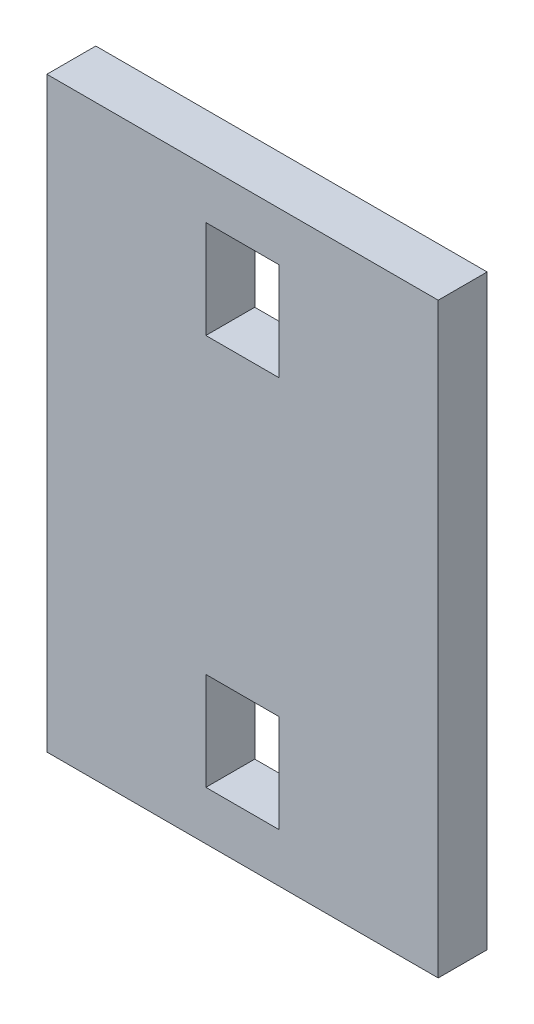
ISO-10303-21;
HEADER;
FILE_DESCRIPTION(('STEP AP214'),'2;1');
FILE_NAME('part.step','',(''),(''),'','','');
FILE_SCHEMA(('AUTOMOTIVE_DESIGN { 1 0 10303 214 1 1 1 1 }'));
ENDSEC;
DATA;
#1=APPLICATION_CONTEXT('core data for automotive mechanical design processes');
#2=APPLICATION_PROTOCOL_DEFINITION('international standard','automotive_design',2000,#1);
#3=PRODUCT_CONTEXT('',#1,'mechanical');
#4=PRODUCT('Part','Part','',(#3));
#5=PRODUCT_RELATED_PRODUCT_CATEGORY('part','',(#4));
#6=PRODUCT_DEFINITION_FORMATION('','',#4);
#7=PRODUCT_DEFINITION_CONTEXT('part definition',#1,'design');
#8=PRODUCT_DEFINITION('design','',#6,#7);
#9=PRODUCT_DEFINITION_SHAPE('','',#8);
#10=(LENGTH_UNIT() NAMED_UNIT(*) SI_UNIT(.MILLI.,.METRE.));
#11=(NAMED_UNIT(*) PLANE_ANGLE_UNIT() SI_UNIT($,.RADIAN.));
#12=(NAMED_UNIT(*) SI_UNIT($,.STERADIAN.) SOLID_ANGLE_UNIT());
#13=UNCERTAINTY_MEASURE_WITH_UNIT(LENGTH_MEASURE(1.E-05),#10,'distance_accuracy_value','');
#14=(GEOMETRIC_REPRESENTATION_CONTEXT(3) GLOBAL_UNCERTAINTY_ASSIGNED_CONTEXT((#13)) GLOBAL_UNIT_ASSIGNED_CONTEXT((#10,
#11,#12)) REPRESENTATION_CONTEXT('',''));
#15=CARTESIAN_POINT('',(0.,0.,0.));
#16=DIRECTION('',(0.,0.,1.));
#17=DIRECTION('',(1.,0.,0.));
#18=AXIS2_PLACEMENT_3D('',#15,#16,#17);
#19=CARTESIAN_POINT('',(0.,0.,6.35));
#20=DIRECTION('',(0.,1.,0.));
#21=DIRECTION('',(0.,0.,1.));
#22=AXIS2_PLACEMENT_3D('',#19,#20,#21);
#23=PLANE('',#22);
#24=DIRECTION('',(1.,0.,0.));
#25=VECTOR('',#24,1.);
#26=CARTESIAN_POINT('',(0.,0.,0.));
#27=LINE('',#26,#25);
#28=CARTESIAN_POINT('',(-50.8,0.,0.));
#29=VERTEX_POINT('',#28);
#30=CARTESIAN_POINT('',(0.,0.,0.));
#31=VERTEX_POINT('',#30);
#32=EDGE_CURVE('E162',#29,#31,#27,.T.);
#33=ORIENTED_EDGE('',*,*,#32,.T.);
#34=DIRECTION('',(0.,0.,-1.));
#35=VECTOR('',#34,1.);
#36=CARTESIAN_POINT('',(0.,0.,6.35));
#37=LINE('',#36,#35);
#38=CARTESIAN_POINT('',(0.,0.,6.35));
#39=VERTEX_POINT('',#38);
#40=EDGE_CURVE('E11',#39,#31,#37,.T.);
#41=ORIENTED_EDGE('',*,*,#40,.F.);
#42=DIRECTION('',(1.,0.,0.));
#43=VECTOR('',#42,1.);
#44=CARTESIAN_POINT('',(0.,0.,6.35));
#45=LINE('',#44,#43);
#46=CARTESIAN_POINT('',(-50.8,0.,6.35));
#47=VERTEX_POINT('',#46);
#48=EDGE_CURVE('E197',#47,#39,#45,.T.);
#49=ORIENTED_EDGE('',*,*,#48,.F.);
#50=DIRECTION('',(0.,0.,-1.));
#51=VECTOR('',#50,1.);
#52=CARTESIAN_POINT('',(-50.8,0.,6.35));
#53=LINE('',#52,#51);
#54=EDGE_CURVE('E210',#47,#29,#53,.T.);
#55=ORIENTED_EDGE('',*,*,#54,.T.);
#56=EDGE_LOOP('',(#33,#41,#49,#55));
#57=FACE_BOUND('',#56,.T.);
#58=ADVANCED_FACE('F39',(#57),#23,.F.);
#59=CARTESIAN_POINT('',(0.,0.,6.35));
#60=DIRECTION('',(-1.,0.,0.));
#61=DIRECTION('',(0.,0.,1.));
#62=AXIS2_PLACEMENT_3D('',#59,#60,#61);
#63=PLANE('',#62);
#64=DIRECTION('',(0.,1.,0.));
#65=VECTOR('',#64,1.);
#66=CARTESIAN_POINT('',(0.,0.,0.));
#67=LINE('',#66,#65);
#68=CARTESIAN_POINT('',(0.,76.2,0.));
#69=VERTEX_POINT('',#68);
#70=EDGE_CURVE('E209',#31,#69,#67,.T.);
#71=ORIENTED_EDGE('',*,*,#70,.T.);
#72=DIRECTION('',(0.,0.,-1.));
#73=VECTOR('',#72,1.);
#74=CARTESIAN_POINT('',(0.,76.2,6.35));
#75=LINE('',#74,#73);
#76=CARTESIAN_POINT('',(0.,76.2,6.35));
#77=VERTEX_POINT('',#76);
#78=EDGE_CURVE('E46',#77,#69,#75,.T.);
#79=ORIENTED_EDGE('',*,*,#78,.F.);
#80=DIRECTION('',(0.,1.,0.));
#81=VECTOR('',#80,1.);
#82=CARTESIAN_POINT('',(0.,0.,6.35));
#83=LINE('',#82,#81);
#84=EDGE_CURVE('E199',#39,#77,#83,.T.);
#85=ORIENTED_EDGE('',*,*,#84,.F.);
#86=ORIENTED_EDGE('',*,*,#40,.T.);
#87=EDGE_LOOP('',(#71,#79,#85,#86));
#88=FACE_BOUND('',#87,.T.);
#89=ADVANCED_FACE('F239',(#88),#63,.F.);
#90=CARTESIAN_POINT('',(0.,76.2,6.35));
#91=DIRECTION('',(0.,-1.,0.));
#92=DIRECTION('',(0.,0.,-1.));
#93=AXIS2_PLACEMENT_3D('',#90,#91,#92);
#94=PLANE('',#93);
#95=DIRECTION('',(-1.,0.,0.));
#96=VECTOR('',#95,1.);
#97=CARTESIAN_POINT('',(0.,76.2,0.));
#98=LINE('',#97,#96);
#99=CARTESIAN_POINT('',(-50.8,76.2,0.));
#100=VERTEX_POINT('',#99);
#101=EDGE_CURVE('E215',#69,#100,#98,.T.);
#102=ORIENTED_EDGE('',*,*,#101,.T.);
#103=DIRECTION('',(0.,0.,-1.));
#104=VECTOR('',#103,1.);
#105=CARTESIAN_POINT('',(-50.8,76.2,6.35));
#106=LINE('',#105,#104);
#107=CARTESIAN_POINT('',(-50.8,76.2,6.35));
#108=VERTEX_POINT('',#107);
#109=EDGE_CURVE('E220',#108,#100,#106,.T.);
#110=ORIENTED_EDGE('',*,*,#109,.F.);
#111=DIRECTION('',(-1.,0.,0.));
#112=VECTOR('',#111,1.);
#113=CARTESIAN_POINT('',(0.,76.2,6.35));
#114=LINE('',#113,#112);
#115=EDGE_CURVE('E201',#77,#108,#114,.T.);
#116=ORIENTED_EDGE('',*,*,#115,.F.);
#117=ORIENTED_EDGE('',*,*,#78,.T.);
#118=EDGE_LOOP('',(#102,#110,#116,#117));
#119=FACE_BOUND('',#118,.T.);
#120=ADVANCED_FACE('F221',(#119),#94,.F.);
#121=CARTESIAN_POINT('',(-50.8,0.,6.35));
#122=DIRECTION('',(1.,0.,0.));
#123=DIRECTION('',(0.,0.,-1.));
#124=AXIS2_PLACEMENT_3D('',#121,#122,#123);
#125=PLANE('',#124);
#126=DIRECTION('',(0.,-1.,0.));
#127=VECTOR('',#126,1.);
#128=CARTESIAN_POINT('',(-50.8,0.,0.));
#129=LINE('',#128,#127);
#130=EDGE_CURVE('E203',#100,#29,#129,.T.);
#131=ORIENTED_EDGE('',*,*,#130,.T.);
#132=ORIENTED_EDGE('',*,*,#54,.F.);
#133=DIRECTION('',(0.,-1.,0.));
#134=VECTOR('',#133,1.);
#135=CARTESIAN_POINT('',(-50.8,0.,6.35));
#136=LINE('',#135,#134);
#137=EDGE_CURVE('E202',#108,#47,#136,.T.);
#138=ORIENTED_EDGE('',*,*,#137,.F.);
#139=ORIENTED_EDGE('',*,*,#109,.T.);
#140=EDGE_LOOP('',(#131,#132,#138,#139));
#141=FACE_BOUND('',#140,.T.);
#142=ADVANCED_FACE('F232',(#141),#125,.F.);
#143=CARTESIAN_POINT('',(0.,0.,6.35));
#144=DIRECTION('',(0.,0.,-1.));
#145=DIRECTION('',(-1.,0.,0.));
#146=AXIS2_PLACEMENT_3D('',#143,#144,#145);
#147=PLANE('',#146);
#148=DIRECTION('',(1.,0.,0.));
#149=VECTOR('',#148,1.);
#150=CARTESIAN_POINT('',(-20.6375,6.35000000000001,6.35));
#151=LINE('',#150,#149);
#152=CARTESIAN_POINT('',(-30.1625,6.35000000000001,6.35));
#153=VERTEX_POINT('',#152);
#154=CARTESIAN_POINT('',(-20.6375,6.35000000000001,6.35));
#155=VERTEX_POINT('',#154);
#156=EDGE_CURVE('E160',#153,#155,#151,.T.);
#157=ORIENTED_EDGE('',*,*,#156,.F.);
#158=DIRECTION('',(0.,-1.,0.));
#159=VECTOR('',#158,1.);
#160=CARTESIAN_POINT('',(-30.1625,6.35000000000001,6.35));
#161=LINE('',#160,#159);
#162=CARTESIAN_POINT('',(-30.1625,19.05,6.35));
#163=VERTEX_POINT('',#162);
#164=EDGE_CURVE('E52',#163,#153,#161,.T.);
#165=ORIENTED_EDGE('',*,*,#164,.F.);
#166=DIRECTION('',(-1.,0.,0.));
#167=VECTOR('',#166,1.);
#168=CARTESIAN_POINT('',(-20.6375,19.05,6.35));
#169=LINE('',#168,#167);
#170=CARTESIAN_POINT('',(-20.6375,19.05,6.35));
#171=VERTEX_POINT('',#170);
#172=EDGE_CURVE('E146',#171,#163,#169,.T.);
#173=ORIENTED_EDGE('',*,*,#172,.F.);
#174=DIRECTION('',(0.,1.,0.));
#175=VECTOR('',#174,1.);
#176=CARTESIAN_POINT('',(-20.6375,6.35000000000001,6.35));
#177=LINE('',#176,#175);
#178=EDGE_CURVE('E151',#155,#171,#177,.T.);
#179=ORIENTED_EDGE('',*,*,#178,.F.);
#180=EDGE_LOOP('',(#157,#165,#173,#179));
#181=FACE_BOUND('',#180,.T.);
#182=DIRECTION('',(-1.,0.,0.));
#183=VECTOR('',#182,1.);
#184=CARTESIAN_POINT('',(-20.6375,69.85,6.35));
#185=LINE('',#184,#183);
#186=CARTESIAN_POINT('',(-20.6375,69.85,6.35));
#187=VERTEX_POINT('',#186);
#188=CARTESIAN_POINT('',(-30.1625,69.85,6.35));
#189=VERTEX_POINT('',#188);
#190=EDGE_CURVE('E181',#187,#189,#185,.T.);
#191=ORIENTED_EDGE('',*,*,#190,.F.);
#192=DIRECTION('',(0.,1.,0.));
#193=VECTOR('',#192,1.);
#194=CARTESIAN_POINT('',(-20.6375,69.85,6.35));
#195=LINE('',#194,#193);
#196=CARTESIAN_POINT('',(-20.6375,57.15,6.35));
#197=VERTEX_POINT('',#196);
#198=EDGE_CURVE('E62',#197,#187,#195,.T.);
#199=ORIENTED_EDGE('',*,*,#198,.F.);
#200=DIRECTION('',(1.,0.,0.));
#201=VECTOR('',#200,1.);
#202=CARTESIAN_POINT('',(-20.6375,57.15,6.35));
#203=LINE('',#202,#201);
#204=CARTESIAN_POINT('',(-30.1625,57.15,6.35));
#205=VERTEX_POINT('',#204);
#206=EDGE_CURVE('E176',#205,#197,#203,.T.);
#207=ORIENTED_EDGE('',*,*,#206,.F.);
#208=DIRECTION('',(0.,-1.,0.));
#209=VECTOR('',#208,1.);
#210=CARTESIAN_POINT('',(-30.1625,69.85,6.35));
#211=LINE('',#210,#209);
#212=EDGE_CURVE('E178',#189,#205,#211,.T.);
#213=ORIENTED_EDGE('',*,*,#212,.F.);
#214=EDGE_LOOP('',(#191,#199,#207,#213));
#215=FACE_BOUND('',#214,.T.);
#216=ORIENTED_EDGE('',*,*,#48,.T.);
#217=ORIENTED_EDGE('',*,*,#84,.T.);
#218=ORIENTED_EDGE('',*,*,#115,.T.);
#219=ORIENTED_EDGE('',*,*,#137,.T.);
#220=EDGE_LOOP('',(#216,#217,#218,#219));
#221=FACE_BOUND('',#220,.T.);
#222=ADVANCED_FACE('F236',(#181,#215,#221),#147,.F.);
#223=CARTESIAN_POINT('',(0.,0.,0.));
#224=DIRECTION('',(0.,0.,-1.));
#225=DIRECTION('',(-1.,0.,0.));
#226=AXIS2_PLACEMENT_3D('',#223,#224,#225);
#227=PLANE('',#226);
#228=DIRECTION('',(0.,-1.,0.));
#229=VECTOR('',#228,1.);
#230=CARTESIAN_POINT('',(-30.1625,6.35000000000001,0.));
#231=LINE('',#230,#229);
#232=CARTESIAN_POINT('',(-30.1625,19.05,0.));
#233=VERTEX_POINT('',#232);
#234=CARTESIAN_POINT('',(-30.1625,6.35000000000001,0.));
#235=VERTEX_POINT('',#234);
#236=EDGE_CURVE('E129',#233,#235,#231,.T.);
#237=ORIENTED_EDGE('',*,*,#236,.T.);
#238=DIRECTION('',(1.,0.,0.));
#239=VECTOR('',#238,1.);
#240=CARTESIAN_POINT('',(-20.6375,6.35000000000001,0.));
#241=LINE('',#240,#239);
#242=CARTESIAN_POINT('',(-20.6375,6.35000000000001,0.));
#243=VERTEX_POINT('',#242);
#244=EDGE_CURVE('E138',#235,#243,#241,.T.);
#245=ORIENTED_EDGE('',*,*,#244,.T.);
#246=DIRECTION('',(0.,1.,0.));
#247=VECTOR('',#246,1.);
#248=CARTESIAN_POINT('',(-20.6375,6.35000000000001,0.));
#249=LINE('',#248,#247);
#250=CARTESIAN_POINT('',(-20.6375,19.05,0.));
#251=VERTEX_POINT('',#250);
#252=EDGE_CURVE('E141',#243,#251,#249,.T.);
#253=ORIENTED_EDGE('',*,*,#252,.T.);
#254=DIRECTION('',(-1.,0.,0.));
#255=VECTOR('',#254,1.);
#256=CARTESIAN_POINT('',(-20.6375,19.05,0.));
#257=LINE('',#256,#255);
#258=EDGE_CURVE('E133',#251,#233,#257,.T.);
#259=ORIENTED_EDGE('',*,*,#258,.T.);
#260=EDGE_LOOP('',(#237,#245,#253,#259));
#261=FACE_BOUND('',#260,.T.);
#262=DIRECTION('',(0.,1.,0.));
#263=VECTOR('',#262,1.);
#264=CARTESIAN_POINT('',(-20.6375,69.85,0.));
#265=LINE('',#264,#263);
#266=CARTESIAN_POINT('',(-20.6375,57.15,0.));
#267=VERTEX_POINT('',#266);
#268=CARTESIAN_POINT('',(-20.6375,69.85,0.));
#269=VERTEX_POINT('',#268);
#270=EDGE_CURVE('E180',#267,#269,#265,.T.);
#271=ORIENTED_EDGE('',*,*,#270,.T.);
#272=DIRECTION('',(-1.,0.,0.));
#273=VECTOR('',#272,1.);
#274=CARTESIAN_POINT('',(-20.6375,69.85,0.));
#275=LINE('',#274,#273);
#276=CARTESIAN_POINT('',(-30.1625,69.85,0.));
#277=VERTEX_POINT('',#276);
#278=EDGE_CURVE('E192',#269,#277,#275,.T.);
#279=ORIENTED_EDGE('',*,*,#278,.T.);
#280=DIRECTION('',(0.,-1.,0.));
#281=VECTOR('',#280,1.);
#282=CARTESIAN_POINT('',(-30.1625,69.85,0.));
#283=LINE('',#282,#281);
#284=CARTESIAN_POINT('',(-30.1625,57.15,0.));
#285=VERTEX_POINT('',#284);
#286=EDGE_CURVE('E186',#277,#285,#283,.T.);
#287=ORIENTED_EDGE('',*,*,#286,.T.);
#288=DIRECTION('',(1.,0.,0.));
#289=VECTOR('',#288,1.);
#290=CARTESIAN_POINT('',(-20.6375,57.15,0.));
#291=LINE('',#290,#289);
#292=EDGE_CURVE('E166',#285,#267,#291,.T.);
#293=ORIENTED_EDGE('',*,*,#292,.T.);
#294=EDGE_LOOP('',(#271,#279,#287,#293));
#295=FACE_BOUND('',#294,.T.);
#296=ORIENTED_EDGE('',*,*,#32,.F.);
#297=ORIENTED_EDGE('',*,*,#130,.F.);
#298=ORIENTED_EDGE('',*,*,#101,.F.);
#299=ORIENTED_EDGE('',*,*,#70,.F.);
#300=EDGE_LOOP('',(#296,#297,#298,#299));
#301=FACE_BOUND('',#300,.T.);
#302=ADVANCED_FACE('F144',(#261,#295,#301),#227,.T.);
#303=CARTESIAN_POINT('',(-20.6375,69.85,0.));
#304=DIRECTION('',(1.,0.,0.));
#305=DIRECTION('',(0.,1.,0.));
#306=AXIS2_PLACEMENT_3D('',#303,#304,#305);
#307=PLANE('',#306);
#308=ORIENTED_EDGE('',*,*,#198,.T.);
#309=DIRECTION('',(0.,0.,1.));
#310=VECTOR('',#309,1.);
#311=CARTESIAN_POINT('',(-20.6375,69.85,0.));
#312=LINE('',#311,#310);
#313=EDGE_CURVE('E170',#269,#187,#312,.T.);
#314=ORIENTED_EDGE('',*,*,#313,.F.);
#315=ORIENTED_EDGE('',*,*,#270,.F.);
#316=DIRECTION('',(0.,0.,1.));
#317=VECTOR('',#316,1.);
#318=CARTESIAN_POINT('',(-20.6375,57.15,0.));
#319=LINE('',#318,#317);
#320=EDGE_CURVE('E171',#267,#197,#319,.T.);
#321=ORIENTED_EDGE('',*,*,#320,.T.);
#322=EDGE_LOOP('',(#308,#314,#315,#321));
#323=FACE_BOUND('',#322,.T.);
#324=ADVANCED_FACE('F253',(#323),#307,.F.);
#325=CARTESIAN_POINT('',(-20.6375,57.15,0.));
#326=DIRECTION('',(0.,-1.,0.));
#327=DIRECTION('',(1.,0.,0.));
#328=AXIS2_PLACEMENT_3D('',#325,#326,#327);
#329=PLANE('',#328);
#330=ORIENTED_EDGE('',*,*,#206,.T.);
#331=ORIENTED_EDGE('',*,*,#320,.F.);
#332=ORIENTED_EDGE('',*,*,#292,.F.);
#333=DIRECTION('',(0.,0.,1.));
#334=VECTOR('',#333,1.);
#335=CARTESIAN_POINT('',(-30.1625,57.15,0.));
#336=LINE('',#335,#334);
#337=EDGE_CURVE('E175',#285,#205,#336,.T.);
#338=ORIENTED_EDGE('',*,*,#337,.T.);
#339=EDGE_LOOP('',(#330,#331,#332,#338));
#340=FACE_BOUND('',#339,.T.);
#341=ADVANCED_FACE('F254',(#340),#329,.F.);
#342=CARTESIAN_POINT('',(-30.1625,69.85,0.));
#343=DIRECTION('',(-1.,0.,0.));
#344=DIRECTION('',(0.,-1.,0.));
#345=AXIS2_PLACEMENT_3D('',#342,#343,#344);
#346=PLANE('',#345);
#347=ORIENTED_EDGE('',*,*,#212,.T.);
#348=ORIENTED_EDGE('',*,*,#337,.F.);
#349=ORIENTED_EDGE('',*,*,#286,.F.);
#350=DIRECTION('',(0.,0.,1.));
#351=VECTOR('',#350,1.);
#352=CARTESIAN_POINT('',(-30.1625,69.85,0.));
#353=LINE('',#352,#351);
#354=EDGE_CURVE('E168',#277,#189,#353,.T.);
#355=ORIENTED_EDGE('',*,*,#354,.T.);
#356=EDGE_LOOP('',(#347,#348,#349,#355));
#357=FACE_BOUND('',#356,.T.);
#358=ADVANCED_FACE('F256',(#357),#346,.F.);
#359=CARTESIAN_POINT('',(-20.6375,69.85,0.));
#360=DIRECTION('',(0.,1.,0.));
#361=DIRECTION('',(0.,0.,1.));
#362=AXIS2_PLACEMENT_3D('',#359,#360,#361);
#363=PLANE('',#362);
#364=ORIENTED_EDGE('',*,*,#190,.T.);
#365=ORIENTED_EDGE('',*,*,#354,.F.);
#366=ORIENTED_EDGE('',*,*,#278,.F.);
#367=ORIENTED_EDGE('',*,*,#313,.T.);
#368=EDGE_LOOP('',(#364,#365,#366,#367));
#369=FACE_BOUND('',#368,.T.);
#370=ADVANCED_FACE('F265',(#369),#363,.F.);
#371=CARTESIAN_POINT('',(-30.1625,6.35000000000001,0.));
#372=DIRECTION('',(-1.,0.,0.));
#373=DIRECTION('',(0.,0.,1.));
#374=AXIS2_PLACEMENT_3D('',#371,#372,#373);
#375=PLANE('',#374);
#376=ORIENTED_EDGE('',*,*,#164,.T.);
#377=DIRECTION('',(0.,0.,1.));
#378=VECTOR('',#377,1.);
#379=CARTESIAN_POINT('',(-30.1625,6.35000000000001,0.));
#380=LINE('',#379,#378);
#381=EDGE_CURVE('E125',#235,#153,#380,.T.);
#382=ORIENTED_EDGE('',*,*,#381,.F.);
#383=ORIENTED_EDGE('',*,*,#236,.F.);
#384=DIRECTION('',(0.,0.,1.));
#385=VECTOR('',#384,1.);
#386=CARTESIAN_POINT('',(-30.1625,19.05,0.));
#387=LINE('',#386,#385);
#388=EDGE_CURVE('E161',#233,#163,#387,.T.);
#389=ORIENTED_EDGE('',*,*,#388,.T.);
#390=EDGE_LOOP('',(#376,#382,#383,#389));
#391=FACE_BOUND('',#390,.T.);
#392=ADVANCED_FACE('F130',(#391),#375,.F.);
#393=CARTESIAN_POINT('',(-20.6375,19.05,0.));
#394=DIRECTION('',(0.,1.,0.));
#395=DIRECTION('',(0.,0.,1.));
#396=AXIS2_PLACEMENT_3D('',#393,#394,#395);
#397=PLANE('',#396);
#398=ORIENTED_EDGE('',*,*,#172,.T.);
#399=ORIENTED_EDGE('',*,*,#388,.F.);
#400=ORIENTED_EDGE('',*,*,#258,.F.);
#401=DIRECTION('',(0.,0.,1.));
#402=VECTOR('',#401,1.);
#403=CARTESIAN_POINT('',(-20.6375,19.05,0.));
#404=LINE('',#403,#402);
#405=EDGE_CURVE('E163',#251,#171,#404,.T.);
#406=ORIENTED_EDGE('',*,*,#405,.T.);
#407=EDGE_LOOP('',(#398,#399,#400,#406));
#408=FACE_BOUND('',#407,.T.);
#409=ADVANCED_FACE('F271',(#408),#397,.F.);
#410=CARTESIAN_POINT('',(-20.6375,6.35000000000001,0.));
#411=DIRECTION('',(1.,0.,0.));
#412=DIRECTION('',(0.,0.,-1.));
#413=AXIS2_PLACEMENT_3D('',#410,#411,#412);
#414=PLANE('',#413);
#415=ORIENTED_EDGE('',*,*,#178,.T.);
#416=ORIENTED_EDGE('',*,*,#405,.F.);
#417=ORIENTED_EDGE('',*,*,#252,.F.);
#418=DIRECTION('',(0.,0.,1.));
#419=VECTOR('',#418,1.);
#420=CARTESIAN_POINT('',(-20.6375,6.35000000000001,0.));
#421=LINE('',#420,#419);
#422=EDGE_CURVE('E131',#243,#155,#421,.T.);
#423=ORIENTED_EDGE('',*,*,#422,.T.);
#424=EDGE_LOOP('',(#415,#416,#417,#423));
#425=FACE_BOUND('',#424,.T.);
#426=ADVANCED_FACE('F273',(#425),#414,.F.);
#427=CARTESIAN_POINT('',(-20.6375,6.35000000000001,0.));
#428=DIRECTION('',(0.,-1.,0.));
#429=DIRECTION('',(1.,0.,0.));
#430=AXIS2_PLACEMENT_3D('',#427,#428,#429);
#431=PLANE('',#430);
#432=ORIENTED_EDGE('',*,*,#156,.T.);
#433=ORIENTED_EDGE('',*,*,#422,.F.);
#434=ORIENTED_EDGE('',*,*,#244,.F.);
#435=ORIENTED_EDGE('',*,*,#381,.T.);
#436=EDGE_LOOP('',(#432,#433,#434,#435));
#437=FACE_BOUND('',#436,.T.);
#438=ADVANCED_FACE('F140',(#437),#431,.F.);
#439=CLOSED_SHELL('',(#58,#89,#120,#142,#222,#302,#324,#341,#358,#370,#392,#409,#426,#438));
#440=MANIFOLD_SOLID_BREP('B2',#439);
#441=ADVANCED_BREP_SHAPE_REPRESENTATION('',(#18,#440),#14);
#442=SHAPE_DEFINITION_REPRESENTATION(#9,#441);
ENDSEC;
END-ISO-10303-21;
